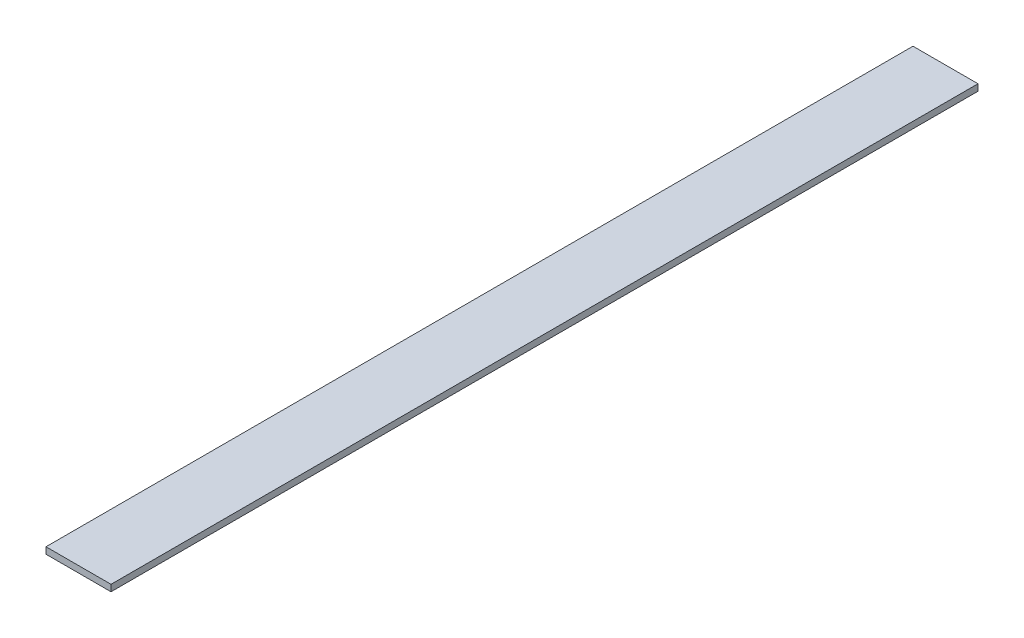
ISO-10303-21;
HEADER;
FILE_DESCRIPTION(('STEP AP214'),'2;1');
FILE_NAME('part.step','',(''),(''),'','','');
FILE_SCHEMA(('AUTOMOTIVE_DESIGN { 1 0 10303 214 1 1 1 1 }'));
ENDSEC;
DATA;
#1=APPLICATION_CONTEXT('core data for automotive mechanical design processes');
#2=APPLICATION_PROTOCOL_DEFINITION('international standard','automotive_design',2000,#1);
#3=PRODUCT_CONTEXT('',#1,'mechanical');
#4=PRODUCT('Part','Part','',(#3));
#5=PRODUCT_RELATED_PRODUCT_CATEGORY('part','',(#4));
#6=PRODUCT_DEFINITION_FORMATION('','',#4);
#7=PRODUCT_DEFINITION_CONTEXT('part definition',#1,'design');
#8=PRODUCT_DEFINITION('design','',#6,#7);
#9=PRODUCT_DEFINITION_SHAPE('','',#8);
#10=(LENGTH_UNIT() NAMED_UNIT(*) SI_UNIT(.MILLI.,.METRE.));
#11=(NAMED_UNIT(*) PLANE_ANGLE_UNIT() SI_UNIT($,.RADIAN.));
#12=(NAMED_UNIT(*) SI_UNIT($,.STERADIAN.) SOLID_ANGLE_UNIT());
#13=UNCERTAINTY_MEASURE_WITH_UNIT(LENGTH_MEASURE(1.E-05),#10,'distance_accuracy_value','');
#14=(GEOMETRIC_REPRESENTATION_CONTEXT(3) GLOBAL_UNCERTAINTY_ASSIGNED_CONTEXT((#13)) GLOBAL_UNIT_ASSIGNED_CONTEXT((#10,
#11,#12)) REPRESENTATION_CONTEXT('',''));
#15=CARTESIAN_POINT('',(0.,0.,0.));
#16=DIRECTION('',(0.,0.,1.));
#17=DIRECTION('',(1.,0.,0.));
#18=AXIS2_PLACEMENT_3D('',#15,#16,#17);
#19=CARTESIAN_POINT('',(-6.51612903225799,3.,-312.756272401434));
#20=DIRECTION('',(-1.,0.,0.));
#21=DIRECTION('',(0.,0.,1.));
#22=AXIS2_PLACEMENT_3D('',#19,#20,#21);
#23=PLANE('',#22);
#24=DIRECTION('',(0.,0.,-1.));
#25=VECTOR('',#24,1.);
#26=CARTESIAN_POINT('',(-6.51612903225799,0.,-312.756272401434));
#27=LINE('',#26,#25);
#28=CARTESIAN_POINT('',(-6.51612903225794,0.,87.2437275985663));
#29=VERTEX_POINT('',#28);
#30=CARTESIAN_POINT('',(-6.51612903225799,0.,-312.756272401434));
#31=VERTEX_POINT('',#30);
#32=EDGE_CURVE('E98',#29,#31,#27,.T.);
#33=ORIENTED_EDGE('',*,*,#32,.T.);
#34=DIRECTION('',(0.,-1.,0.));
#35=VECTOR('',#34,1.);
#36=CARTESIAN_POINT('',(-6.51612903225799,3.,-312.756272401434));
#37=LINE('',#36,#35);
#38=CARTESIAN_POINT('',(-6.51612903225799,3.,-312.756272401434));
#39=VERTEX_POINT('',#38);
#40=EDGE_CURVE('E11',#39,#31,#37,.T.);
#41=ORIENTED_EDGE('',*,*,#40,.F.);
#42=DIRECTION('',(0.,0.,-1.));
#43=VECTOR('',#42,1.);
#44=CARTESIAN_POINT('',(-6.51612903225799,3.,-312.756272401434));
#45=LINE('',#44,#43);
#46=CARTESIAN_POINT('',(-6.51612903225794,3.,87.2437275985663));
#47=VERTEX_POINT('',#46);
#48=EDGE_CURVE('E86',#47,#39,#45,.T.);
#49=ORIENTED_EDGE('',*,*,#48,.F.);
#50=DIRECTION('',(0.,-1.,0.));
#51=VECTOR('',#50,1.);
#52=CARTESIAN_POINT('',(-6.51612903225794,3.,87.2437275985663));
#53=LINE('',#52,#51);
#54=EDGE_CURVE('E94',#47,#29,#53,.T.);
#55=ORIENTED_EDGE('',*,*,#54,.T.);
#56=EDGE_LOOP('',(#33,#41,#49,#55));
#57=FACE_BOUND('',#56,.T.);
#58=ADVANCED_FACE('F35',(#57),#23,.F.);
#59=CARTESIAN_POINT('',(-36.516129032258,3.,-312.756272401434));
#60=DIRECTION('',(0.,0.,1.));
#61=DIRECTION('',(1.,0.,0.));
#62=AXIS2_PLACEMENT_3D('',#59,#60,#61);
#63=PLANE('',#62);
#64=DIRECTION('',(-1.,0.,0.));
#65=VECTOR('',#64,1.);
#66=CARTESIAN_POINT('',(-36.516129032258,0.,-312.756272401434));
#67=LINE('',#66,#65);
#68=CARTESIAN_POINT('',(-36.516129032258,0.,-312.756272401434));
#69=VERTEX_POINT('',#68);
#70=EDGE_CURVE('E90',#31,#69,#67,.T.);
#71=ORIENTED_EDGE('',*,*,#70,.T.);
#72=DIRECTION('',(0.,-1.,0.));
#73=VECTOR('',#72,1.);
#74=CARTESIAN_POINT('',(-36.516129032258,3.,-312.756272401434));
#75=LINE('',#74,#73);
#76=CARTESIAN_POINT('',(-36.516129032258,3.,-312.756272401434));
#77=VERTEX_POINT('',#76);
#78=EDGE_CURVE('E43',#77,#69,#75,.T.);
#79=ORIENTED_EDGE('',*,*,#78,.F.);
#80=DIRECTION('',(-1.,0.,0.));
#81=VECTOR('',#80,1.);
#82=CARTESIAN_POINT('',(-36.516129032258,3.,-312.756272401434));
#83=LINE('',#82,#81);
#84=EDGE_CURVE('E81',#39,#77,#83,.T.);
#85=ORIENTED_EDGE('',*,*,#84,.F.);
#86=ORIENTED_EDGE('',*,*,#40,.T.);
#87=EDGE_LOOP('',(#71,#79,#85,#86));
#88=FACE_BOUND('',#87,.T.);
#89=ADVANCED_FACE('F89',(#88),#63,.F.);
#90=CARTESIAN_POINT('',(-36.516129032258,3.,-312.756272401434));
#91=DIRECTION('',(1.,0.,0.));
#92=DIRECTION('',(0.,0.,-1.));
#93=AXIS2_PLACEMENT_3D('',#90,#91,#92);
#94=PLANE('',#93);
#95=DIRECTION('',(0.,0.,1.));
#96=VECTOR('',#95,1.);
#97=CARTESIAN_POINT('',(-36.516129032258,0.,-312.756272401434));
#98=LINE('',#97,#96);
#99=CARTESIAN_POINT('',(-36.5161290322579,0.,87.2437275985663));
#100=VERTEX_POINT('',#99);
#101=EDGE_CURVE('E68',#69,#100,#98,.T.);
#102=ORIENTED_EDGE('',*,*,#101,.T.);
#103=DIRECTION('',(0.,-1.,0.));
#104=VECTOR('',#103,1.);
#105=CARTESIAN_POINT('',(-36.5161290322579,3.,87.2437275985663));
#106=LINE('',#105,#104);
#107=CARTESIAN_POINT('',(-36.5161290322579,3.,87.2437275985663));
#108=VERTEX_POINT('',#107);
#109=EDGE_CURVE('E91',#108,#100,#106,.T.);
#110=ORIENTED_EDGE('',*,*,#109,.F.);
#111=DIRECTION('',(0.,0.,1.));
#112=VECTOR('',#111,1.);
#113=CARTESIAN_POINT('',(-36.516129032258,3.,-312.756272401434));
#114=LINE('',#113,#112);
#115=EDGE_CURVE('E84',#77,#108,#114,.T.);
#116=ORIENTED_EDGE('',*,*,#115,.F.);
#117=ORIENTED_EDGE('',*,*,#78,.T.);
#118=EDGE_LOOP('',(#102,#110,#116,#117));
#119=FACE_BOUND('',#118,.T.);
#120=ADVANCED_FACE('F92',(#119),#94,.F.);
#121=CARTESIAN_POINT('',(-36.5161290322579,3.,87.2437275985663));
#122=DIRECTION('',(0.,0.,-1.));
#123=DIRECTION('',(-1.,0.,0.));
#124=AXIS2_PLACEMENT_3D('',#121,#122,#123);
#125=PLANE('',#124);
#126=DIRECTION('',(1.,0.,0.));
#127=VECTOR('',#126,1.);
#128=CARTESIAN_POINT('',(-36.5161290322579,0.,87.2437275985663));
#129=LINE('',#128,#127);
#130=EDGE_CURVE('E74',#100,#29,#129,.T.);
#131=ORIENTED_EDGE('',*,*,#130,.T.);
#132=ORIENTED_EDGE('',*,*,#54,.F.);
#133=DIRECTION('',(1.,0.,0.));
#134=VECTOR('',#133,1.);
#135=CARTESIAN_POINT('',(-36.5161290322579,3.,87.2437275985663));
#136=LINE('',#135,#134);
#137=EDGE_CURVE('E51',#108,#47,#136,.T.);
#138=ORIENTED_EDGE('',*,*,#137,.F.);
#139=ORIENTED_EDGE('',*,*,#109,.T.);
#140=EDGE_LOOP('',(#131,#132,#138,#139));
#141=FACE_BOUND('',#140,.T.);
#142=ADVANCED_FACE('F105',(#141),#125,.F.);
#143=CARTESIAN_POINT('',(0.,3.,0.));
#144=DIRECTION('',(0.,1.,0.));
#145=DIRECTION('',(0.,0.,1.));
#146=AXIS2_PLACEMENT_3D('',#143,#144,#145);
#147=PLANE('',#146);
#148=ORIENTED_EDGE('',*,*,#48,.T.);
#149=ORIENTED_EDGE('',*,*,#84,.T.);
#150=ORIENTED_EDGE('',*,*,#115,.T.);
#151=ORIENTED_EDGE('',*,*,#137,.T.);
#152=EDGE_LOOP('',(#148,#149,#150,#151));
#153=FACE_BOUND('',#152,.T.);
#154=ADVANCED_FACE('F82',(#153),#147,.T.);
#155=CARTESIAN_POINT('',(0.,0.,0.));
#156=DIRECTION('',(0.,1.,0.));
#157=DIRECTION('',(0.,0.,1.));
#158=AXIS2_PLACEMENT_3D('',#155,#156,#157);
#159=PLANE('',#158);
#160=ORIENTED_EDGE('',*,*,#32,.F.);
#161=ORIENTED_EDGE('',*,*,#130,.F.);
#162=ORIENTED_EDGE('',*,*,#101,.F.);
#163=ORIENTED_EDGE('',*,*,#70,.F.);
#164=EDGE_LOOP('',(#160,#161,#162,#163));
#165=FACE_BOUND('',#164,.T.);
#166=ADVANCED_FACE('F108',(#165),#159,.F.);
#167=CLOSED_SHELL('',(#58,#89,#120,#142,#154,#166));
#168=MANIFOLD_SOLID_BREP('B2',#167);
#169=ADVANCED_BREP_SHAPE_REPRESENTATION('',(#18,#168),#14);
#170=SHAPE_DEFINITION_REPRESENTATION(#9,#169);
ENDSEC;
END-ISO-10303-21;
